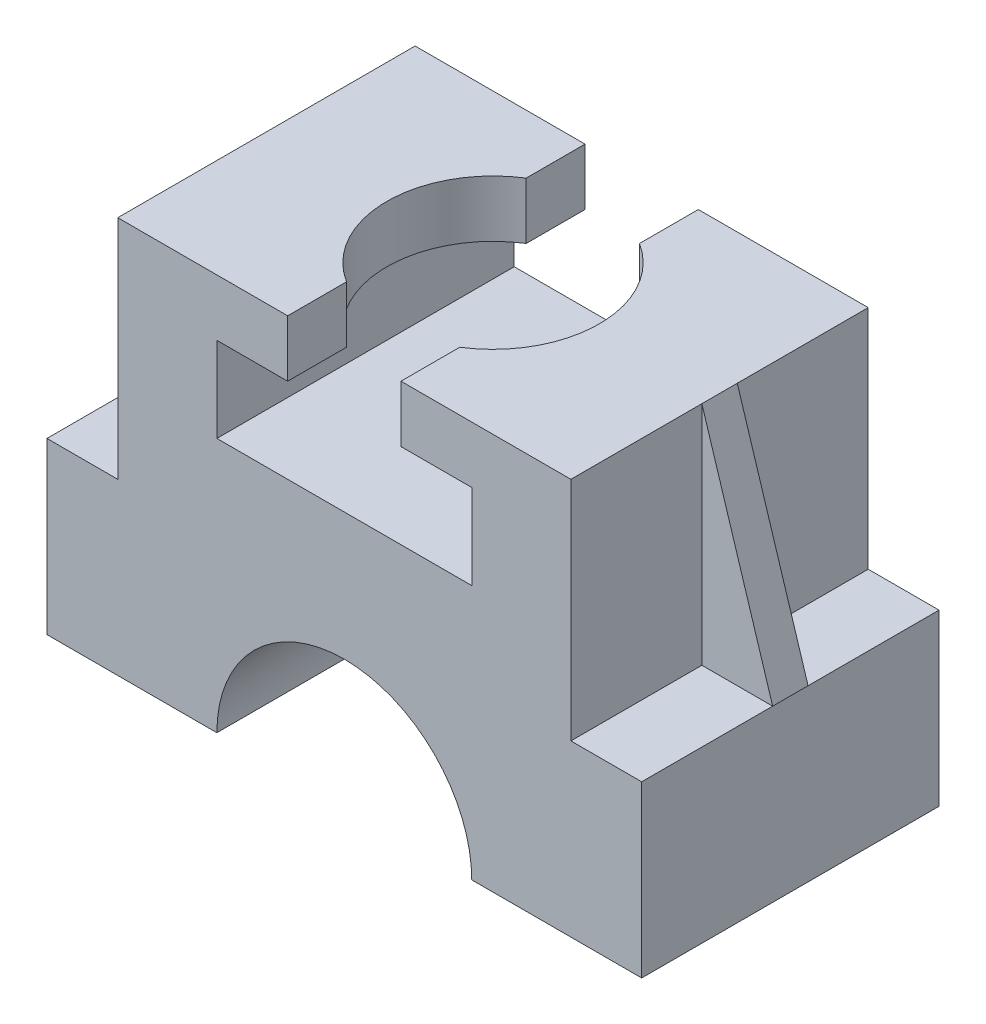
ISO-10303-21;
HEADER;
FILE_DESCRIPTION(('STEP AP214'),'2;1');
FILE_NAME('part.step','',(''),(''),'','','');
FILE_SCHEMA(('AUTOMOTIVE_DESIGN { 1 0 10303 214 1 1 1 1 }'));
ENDSEC;
DATA;
#1=APPLICATION_CONTEXT('core data for automotive mechanical design processes');
#2=APPLICATION_PROTOCOL_DEFINITION('international standard','automotive_design',2000,#1);
#3=PRODUCT_CONTEXT('',#1,'mechanical');
#4=PRODUCT('Part','Part','',(#3));
#5=PRODUCT_RELATED_PRODUCT_CATEGORY('part','',(#4));
#6=PRODUCT_DEFINITION_FORMATION('','',#4);
#7=PRODUCT_DEFINITION_CONTEXT('part definition',#1,'design');
#8=PRODUCT_DEFINITION('design','',#6,#7);
#9=PRODUCT_DEFINITION_SHAPE('','',#8);
#10=(LENGTH_UNIT() NAMED_UNIT(*) SI_UNIT(.MILLI.,.METRE.));
#11=(NAMED_UNIT(*) PLANE_ANGLE_UNIT() SI_UNIT($,.RADIAN.));
#12=(NAMED_UNIT(*) SI_UNIT($,.STERADIAN.) SOLID_ANGLE_UNIT());
#13=UNCERTAINTY_MEASURE_WITH_UNIT(LENGTH_MEASURE(1.E-05),#10,'distance_accuracy_value','');
#14=(GEOMETRIC_REPRESENTATION_CONTEXT(3) GLOBAL_UNCERTAINTY_ASSIGNED_CONTEXT((#13)) GLOBAL_UNIT_ASSIGNED_CONTEXT((#10,
#11,#12)) REPRESENTATION_CONTEXT('',''));
#15=CARTESIAN_POINT('',(0.,0.,0.));
#16=DIRECTION('',(0.,0.,1.));
#17=DIRECTION('',(1.,0.,0.));
#18=AXIS2_PLACEMENT_3D('',#15,#16,#17);
#19=CARTESIAN_POINT('',(-80.,60.,-52.5));
#20=DIRECTION('',(0.,1.,0.));
#21=DIRECTION('',(0.,0.,1.));
#22=AXIS2_PLACEMENT_3D('',#19,#20,#21);
#23=PLANE('',#22);
#24=DIRECTION('',(0.,0.,1.));
#25=VECTOR('',#24,1.);
#26=CARTESIAN_POINT('',(-105.,60.,-52.5));
#27=LINE('',#26,#25);
#28=CARTESIAN_POINT('',(-105.,60.,-52.5));
#29=VERTEX_POINT('',#28);
#30=CARTESIAN_POINT('',(-105.,60.,-6.25));
#31=VERTEX_POINT('',#30);
#32=EDGE_CURVE('E11',#29,#31,#27,.T.);
#33=ORIENTED_EDGE('',*,*,#32,.T.);
#34=DIRECTION('',(-1.,0.,0.));
#35=VECTOR('',#34,1.);
#36=CARTESIAN_POINT('',(-105.,60.,-6.25));
#37=LINE('',#36,#35);
#38=CARTESIAN_POINT('',(-80.,60.,-6.25));
#39=VERTEX_POINT('',#38);
#40=EDGE_CURVE('E243',#39,#31,#37,.T.);
#41=ORIENTED_EDGE('',*,*,#40,.F.);
#42=DIRECTION('',(0.,0.,1.));
#43=VECTOR('',#42,1.);
#44=CARTESIAN_POINT('',(-80.,60.,-52.5));
#45=LINE('',#44,#43);
#46=CARTESIAN_POINT('',(-80.,60.,-52.5));
#47=VERTEX_POINT('',#46);
#48=EDGE_CURVE('E498',#47,#39,#45,.T.);
#49=ORIENTED_EDGE('',*,*,#48,.F.);
#50=DIRECTION('',(-1.,0.,0.));
#51=VECTOR('',#50,1.);
#52=CARTESIAN_POINT('',(-80.,60.,-52.5));
#53=LINE('',#52,#51);
#54=EDGE_CURVE('E494',#47,#29,#53,.T.);
#55=ORIENTED_EDGE('',*,*,#54,.T.);
#56=EDGE_LOOP('',(#33,#41,#49,#55));
#57=FACE_BOUND('',#56,.T.);
#58=ADVANCED_FACE('F45',(#57),#23,.T.);
#59=CARTESIAN_POINT('',(-80.,140.,-52.5));
#60=DIRECTION('',(-1.,0.,0.));
#61=DIRECTION('',(0.,0.,1.));
#62=AXIS2_PLACEMENT_3D('',#59,#60,#61);
#63=PLANE('',#62);
#64=ORIENTED_EDGE('',*,*,#48,.T.);
#65=DIRECTION('',(0.,-1.,0.));
#66=VECTOR('',#65,1.);
#67=CARTESIAN_POINT('',(-80.,60.,-6.25));
#68=LINE('',#67,#66);
#69=CARTESIAN_POINT('',(-80.,140.,-6.25));
#70=VERTEX_POINT('',#69);
#71=EDGE_CURVE('E604',#70,#39,#68,.T.);
#72=ORIENTED_EDGE('',*,*,#71,.F.);
#73=DIRECTION('',(0.,0.,1.));
#74=VECTOR('',#73,1.);
#75=CARTESIAN_POINT('',(-80.,140.,-52.5));
#76=LINE('',#75,#74);
#77=CARTESIAN_POINT('',(-80.,140.,-52.5));
#78=VERTEX_POINT('',#77);
#79=EDGE_CURVE('E263',#78,#70,#76,.T.);
#80=ORIENTED_EDGE('',*,*,#79,.F.);
#81=DIRECTION('',(0.,-1.,0.));
#82=VECTOR('',#81,1.);
#83=CARTESIAN_POINT('',(-80.,140.,-52.5));
#84=LINE('',#83,#82);
#85=EDGE_CURVE('E490',#78,#47,#84,.T.);
#86=ORIENTED_EDGE('',*,*,#85,.T.);
#87=EDGE_LOOP('',(#64,#72,#80,#86));
#88=FACE_BOUND('',#87,.T.);
#89=ADVANCED_FACE('F602',(#88),#63,.T.);
#90=CARTESIAN_POINT('',(80.,60.,-52.5));
#91=DIRECTION('',(1.,0.,0.));
#92=DIRECTION('',(0.,0.,-1.));
#93=AXIS2_PLACEMENT_3D('',#90,#91,#92);
#94=PLANE('',#93);
#95=DIRECTION('',(0.,0.,1.));
#96=VECTOR('',#95,1.);
#97=CARTESIAN_POINT('',(80.,140.,-52.5));
#98=LINE('',#97,#96);
#99=CARTESIAN_POINT('',(80.,140.,-52.5));
#100=VERTEX_POINT('',#99);
#101=CARTESIAN_POINT('',(80.,140.,-6.25));
#102=VERTEX_POINT('',#101);
#103=EDGE_CURVE('E264',#100,#102,#98,.T.);
#104=ORIENTED_EDGE('',*,*,#103,.T.);
#105=DIRECTION('',(0.,-1.,0.));
#106=VECTOR('',#105,1.);
#107=CARTESIAN_POINT('',(80.,60.,-6.25));
#108=LINE('',#107,#106);
#109=CARTESIAN_POINT('',(80.,60.,-6.25));
#110=VERTEX_POINT('',#109);
#111=EDGE_CURVE('E271',#102,#110,#108,.T.);
#112=ORIENTED_EDGE('',*,*,#111,.T.);
#113=DIRECTION('',(0.,0.,1.));
#114=VECTOR('',#113,1.);
#115=CARTESIAN_POINT('',(80.,60.,-52.5));
#116=LINE('',#115,#114);
#117=CARTESIAN_POINT('',(80.,60.,-52.5));
#118=VERTEX_POINT('',#117);
#119=EDGE_CURVE('E508',#118,#110,#116,.T.);
#120=ORIENTED_EDGE('',*,*,#119,.F.);
#121=DIRECTION('',(0.,1.,0.));
#122=VECTOR('',#121,1.);
#123=CARTESIAN_POINT('',(80.,60.,-52.5));
#124=LINE('',#123,#122);
#125=EDGE_CURVE('E481',#118,#100,#124,.T.);
#126=ORIENTED_EDGE('',*,*,#125,.T.);
#127=EDGE_LOOP('',(#104,#112,#120,#126));
#128=FACE_BOUND('',#127,.T.);
#129=ADVANCED_FACE('F629',(#128),#94,.T.);
#130=CARTESIAN_POINT('',(105.,60.,-52.5));
#131=DIRECTION('',(0.,1.,0.));
#132=DIRECTION('',(-1.,0.,0.));
#133=AXIS2_PLACEMENT_3D('',#130,#131,#132);
#134=PLANE('',#133);
#135=ORIENTED_EDGE('',*,*,#119,.T.);
#136=DIRECTION('',(1.,0.,0.));
#137=VECTOR('',#136,1.);
#138=CARTESIAN_POINT('',(105.,60.,-6.25));
#139=LINE('',#138,#137);
#140=CARTESIAN_POINT('',(105.,60.,-6.25));
#141=VERTEX_POINT('',#140);
#142=EDGE_CURVE('E276',#110,#141,#139,.T.);
#143=ORIENTED_EDGE('',*,*,#142,.T.);
#144=DIRECTION('',(0.,0.,1.));
#145=VECTOR('',#144,1.);
#146=CARTESIAN_POINT('',(105.,60.,-52.5));
#147=LINE('',#146,#145);
#148=CARTESIAN_POINT('',(105.,60.,-52.5));
#149=VERTEX_POINT('',#148);
#150=EDGE_CURVE('E513',#149,#141,#147,.T.);
#151=ORIENTED_EDGE('',*,*,#150,.F.);
#152=DIRECTION('',(-1.,0.,0.));
#153=VECTOR('',#152,1.);
#154=CARTESIAN_POINT('',(105.,60.,-52.5));
#155=LINE('',#154,#153);
#156=EDGE_CURVE('E477',#149,#118,#155,.T.);
#157=ORIENTED_EDGE('',*,*,#156,.T.);
#158=EDGE_LOOP('',(#135,#143,#151,#157));
#159=FACE_BOUND('',#158,.T.);
#160=ADVANCED_FACE('F661',(#159),#134,.T.);
#161=CARTESIAN_POINT('',(80.,140.,-52.5));
#162=DIRECTION('',(0.,1.,0.));
#163=DIRECTION('',(0.,0.,1.));
#164=AXIS2_PLACEMENT_3D('',#161,#162,#163);
#165=PLANE('',#164);
#166=DIRECTION('',(0.,0.,1.));
#167=VECTOR('',#166,1.);
#168=CARTESIAN_POINT('',(-20.,140.,31.7214438511238));
#169=LINE('',#168,#167);
#170=CARTESIAN_POINT('',(-20.,140.,31.7214438511238));
#171=VERTEX_POINT('',#170);
#172=CARTESIAN_POINT('',(-20.,140.,52.5));
#173=VERTEX_POINT('',#172);
#174=EDGE_CURVE('E334',#171,#173,#169,.T.);
#175=ORIENTED_EDGE('',*,*,#174,.F.);
#176=CARTESIAN_POINT('',(0.,140.,0.));
#177=DIRECTION('',(0.,1.,0.));
#178=DIRECTION('',(0.,0.,1.));
#179=AXIS2_PLACEMENT_3D('',#176,#177,#178);
#180=CIRCLE('',#179,37.5);
#181=CARTESIAN_POINT('',(-20.,140.,-31.7214438511238));
#182=VERTEX_POINT('',#181);
#183=EDGE_CURVE('E330',#182,#171,#180,.T.);
#184=ORIENTED_EDGE('',*,*,#183,.F.);
#185=DIRECTION('',(0.,0.,1.));
#186=VECTOR('',#185,1.);
#187=CARTESIAN_POINT('',(-20.,140.,-52.5));
#188=LINE('',#187,#186);
#189=CARTESIAN_POINT('',(-20.,140.,-52.5));
#190=VERTEX_POINT('',#189);
#191=EDGE_CURVE('E326',#190,#182,#188,.T.);
#192=ORIENTED_EDGE('',*,*,#191,.F.);
#193=DIRECTION('',(-1.,0.,0.));
#194=VECTOR('',#193,1.);
#195=CARTESIAN_POINT('',(80.,140.,-52.5));
#196=LINE('',#195,#194);
#197=EDGE_CURVE('E485',#190,#78,#196,.T.);
#198=ORIENTED_EDGE('',*,*,#197,.T.);
#199=ORIENTED_EDGE('',*,*,#79,.T.);
#200=DIRECTION('',(0.,0.,-1.));
#201=VECTOR('',#200,1.);
#202=CARTESIAN_POINT('',(-80.,140.,6.25));
#203=LINE('',#202,#201);
#204=CARTESIAN_POINT('',(-80.,140.,6.25));
#205=VERTEX_POINT('',#204);
#206=EDGE_CURVE('E248',#205,#70,#203,.T.);
#207=ORIENTED_EDGE('',*,*,#206,.F.);
#208=CARTESIAN_POINT('',(-80.,140.,52.5));
#209=VERTEX_POINT('',#208);
#210=EDGE_CURVE('E255',#205,#209,#76,.T.);
#211=ORIENTED_EDGE('',*,*,#210,.T.);
#212=DIRECTION('',(-1.,0.,0.));
#213=VECTOR('',#212,1.);
#214=CARTESIAN_POINT('',(80.,140.,52.5));
#215=LINE('',#214,#213);
#216=EDGE_CURVE('E453',#173,#209,#215,.T.);
#217=ORIENTED_EDGE('',*,*,#216,.F.);
#218=EDGE_LOOP('',(#175,#184,#192,#198,#199,#207,#211,#217));
#219=FACE_BOUND('',#218,.T.);
#220=ADVANCED_FACE('F268',(#219),#165,.T.);
#221=CARTESIAN_POINT('',(-45.,120.,-52.5));
#222=DIRECTION('',(0.,1.,0.));
#223=DIRECTION('',(0.,0.,1.));
#224=AXIS2_PLACEMENT_3D('',#221,#222,#223);
#225=PLANE('',#224);
#226=CARTESIAN_POINT('',(0.,120.,0.));
#227=DIRECTION('',(0.,1.,0.));
#228=DIRECTION('',(0.,0.,1.));
#229=AXIS2_PLACEMENT_3D('',#226,#227,#228);
#230=CIRCLE('',#229,37.5);
#231=CARTESIAN_POINT('',(-20.,120.,31.7214438511238));
#232=VERTEX_POINT('',#231);
#233=CARTESIAN_POINT('',(-20.,120.,-31.7214438511238));
#234=VERTEX_POINT('',#233);
#235=EDGE_CURVE('E312',#232,#234,#230,.F.);
#236=ORIENTED_EDGE('',*,*,#235,.F.);
#237=DIRECTION('',(0.,0.,-1.));
#238=VECTOR('',#237,1.);
#239=CARTESIAN_POINT('',(-20.,120.,31.7214438511238));
#240=LINE('',#239,#238);
#241=CARTESIAN_POINT('',(-20.,120.,52.5));
#242=VERTEX_POINT('',#241);
#243=EDGE_CURVE('E315',#242,#232,#240,.T.);
#244=ORIENTED_EDGE('',*,*,#243,.F.);
#245=DIRECTION('',(-1.,0.,0.));
#246=VECTOR('',#245,1.);
#247=CARTESIAN_POINT('',(-45.,120.,52.5));
#248=LINE('',#247,#246);
#249=CARTESIAN_POINT('',(-45.,120.,52.5));
#250=VERTEX_POINT('',#249);
#251=EDGE_CURVE('E371',#242,#250,#248,.T.);
#252=ORIENTED_EDGE('',*,*,#251,.T.);
#253=DIRECTION('',(0.,0.,1.));
#254=VECTOR('',#253,1.);
#255=CARTESIAN_POINT('',(-45.,120.,-52.5));
#256=LINE('',#255,#254);
#257=CARTESIAN_POINT('',(-45.,120.,-52.5));
#258=VERTEX_POINT('',#257);
#259=EDGE_CURVE('E389',#258,#250,#256,.T.);
#260=ORIENTED_EDGE('',*,*,#259,.F.);
#261=DIRECTION('',(-1.,0.,0.));
#262=VECTOR('',#261,1.);
#263=CARTESIAN_POINT('',(-45.,120.,-52.5));
#264=LINE('',#263,#262);
#265=CARTESIAN_POINT('',(-20.,120.,-52.5));
#266=VERTEX_POINT('',#265);
#267=EDGE_CURVE('E377',#266,#258,#264,.T.);
#268=ORIENTED_EDGE('',*,*,#267,.F.);
#269=DIRECTION('',(0.,0.,-1.));
#270=VECTOR('',#269,1.);
#271=CARTESIAN_POINT('',(-20.,120.,-52.5));
#272=LINE('',#271,#270);
#273=EDGE_CURVE('E309',#234,#266,#272,.T.);
#274=ORIENTED_EDGE('',*,*,#273,.F.);
#275=EDGE_LOOP('',(#236,#244,#252,#260,#268,#274));
#276=FACE_BOUND('',#275,.T.);
#277=ADVANCED_FACE('F586',(#276),#225,.F.);
#278=CARTESIAN_POINT('',(-105.,0.,-52.5));
#279=DIRECTION('',(0.,-1.,0.));
#280=DIRECTION('',(0.,0.,-1.));
#281=AXIS2_PLACEMENT_3D('',#278,#279,#280);
#282=PLANE('',#281);
#283=DIRECTION('',(0.,0.,1.));
#284=VECTOR('',#283,1.);
#285=CARTESIAN_POINT('',(45.,0.,-52.5));
#286=LINE('',#285,#284);
#287=CARTESIAN_POINT('',(45.,0.,-52.5));
#288=VERTEX_POINT('',#287);
#289=CARTESIAN_POINT('',(45.,0.,52.5));
#290=VERTEX_POINT('',#289);
#291=EDGE_CURVE('E426',#288,#290,#286,.T.);
#292=ORIENTED_EDGE('',*,*,#291,.F.);
#293=DIRECTION('',(1.,0.,0.));
#294=VECTOR('',#293,1.);
#295=CARTESIAN_POINT('',(-105.,0.,-52.5));
#296=LINE('',#295,#294);
#297=CARTESIAN_POINT('',(105.,0.,-52.5));
#298=VERTEX_POINT('',#297);
#299=EDGE_CURVE('E468',#288,#298,#296,.T.);
#300=ORIENTED_EDGE('',*,*,#299,.T.);
#301=DIRECTION('',(0.,0.,1.));
#302=VECTOR('',#301,1.);
#303=CARTESIAN_POINT('',(105.,0.,-52.5));
#304=LINE('',#303,#302);
#305=CARTESIAN_POINT('',(105.,0.,52.5));
#306=VERTEX_POINT('',#305);
#307=EDGE_CURVE('E517',#298,#306,#304,.T.);
#308=ORIENTED_EDGE('',*,*,#307,.T.);
#309=DIRECTION('',(1.,0.,0.));
#310=VECTOR('',#309,1.);
#311=CARTESIAN_POINT('',(-105.,0.,52.5));
#312=LINE('',#311,#310);
#313=EDGE_CURVE('E436',#290,#306,#312,.T.);
#314=ORIENTED_EDGE('',*,*,#313,.F.);
#315=EDGE_LOOP('',(#292,#300,#308,#314));
#316=FACE_BOUND('',#315,.T.);
#317=ADVANCED_FACE('F637',(#316),#282,.T.);
#318=CARTESIAN_POINT('',(-105.,60.,-52.5));
#319=DIRECTION('',(-1.,0.,0.));
#320=DIRECTION('',(0.,-1.,0.));
#321=AXIS2_PLACEMENT_3D('',#318,#319,#320);
#322=PLANE('',#321);
#323=DIRECTION('',(0.,0.,1.));
#324=VECTOR('',#323,1.);
#325=CARTESIAN_POINT('',(-105.,0.,-52.5));
#326=LINE('',#325,#324);
#327=CARTESIAN_POINT('',(-105.,0.,-52.5));
#328=VERTEX_POINT('',#327);
#329=CARTESIAN_POINT('',(-105.,0.,52.5));
#330=VERTEX_POINT('',#329);
#331=EDGE_CURVE('E49',#328,#330,#326,.T.);
#332=ORIENTED_EDGE('',*,*,#331,.T.);
#333=DIRECTION('',(0.,-1.,0.));
#334=VECTOR('',#333,1.);
#335=CARTESIAN_POINT('',(-105.,60.,52.5));
#336=LINE('',#335,#334);
#337=CARTESIAN_POINT('',(-105.,60.,52.5));
#338=VERTEX_POINT('',#337);
#339=EDGE_CURVE('E429',#338,#330,#336,.T.);
#340=ORIENTED_EDGE('',*,*,#339,.F.);
#341=CARTESIAN_POINT('',(-105.,60.,6.25));
#342=VERTEX_POINT('',#341);
#343=EDGE_CURVE('E55',#342,#338,#27,.T.);
#344=ORIENTED_EDGE('',*,*,#343,.F.);
#345=DIRECTION('',(0.,0.,-1.));
#346=VECTOR('',#345,1.);
#347=CARTESIAN_POINT('',(-105.,60.,6.25));
#348=LINE('',#347,#346);
#349=EDGE_CURVE('E251',#342,#31,#348,.T.);
#350=ORIENTED_EDGE('',*,*,#349,.T.);
#351=ORIENTED_EDGE('',*,*,#32,.F.);
#352=DIRECTION('',(0.,-1.,0.));
#353=VECTOR('',#352,1.);
#354=CARTESIAN_POINT('',(-105.,60.,-52.5));
#355=LINE('',#354,#353);
#356=EDGE_CURVE('E464',#29,#328,#355,.T.);
#357=ORIENTED_EDGE('',*,*,#356,.T.);
#358=EDGE_LOOP('',(#332,#340,#344,#350,#351,#357));
#359=FACE_BOUND('',#358,.T.);
#360=ADVANCED_FACE('F47',(#359),#322,.T.);
#361=DIRECTION('',(-1.,0.,0.));
#362=VECTOR('',#361,1.);
#363=CARTESIAN_POINT('',(-105.,60.,6.25));
#364=LINE('',#363,#362);
#365=CARTESIAN_POINT('',(-80.,60.,6.25));
#366=VERTEX_POINT('',#365);
#367=EDGE_CURVE('E238',#366,#342,#364,.T.);
#368=ORIENTED_EDGE('',*,*,#367,.T.);
#369=ORIENTED_EDGE('',*,*,#343,.T.);
#370=DIRECTION('',(-1.,0.,0.));
#371=VECTOR('',#370,1.);
#372=CARTESIAN_POINT('',(-80.,60.,52.5));
#373=LINE('',#372,#371);
#374=CARTESIAN_POINT('',(-80.,60.,52.5));
#375=VERTEX_POINT('',#374);
#376=EDGE_CURVE('E460',#375,#338,#373,.T.);
#377=ORIENTED_EDGE('',*,*,#376,.F.);
#378=EDGE_CURVE('E501',#366,#375,#45,.T.);
#379=ORIENTED_EDGE('',*,*,#378,.F.);
#380=EDGE_LOOP('',(#368,#369,#377,#379));
#381=FACE_BOUND('',#380,.T.);
#382=ADVANCED_FACE('F540',(#381),#23,.T.);
#383=DIRECTION('',(0.,-1.,0.));
#384=VECTOR('',#383,1.);
#385=CARTESIAN_POINT('',(-80.,60.,6.25));
#386=LINE('',#385,#384);
#387=EDGE_CURVE('E233',#205,#366,#386,.T.);
#388=ORIENTED_EDGE('',*,*,#387,.T.);
#389=ORIENTED_EDGE('',*,*,#378,.T.);
#390=DIRECTION('',(0.,-1.,0.));
#391=VECTOR('',#390,1.);
#392=CARTESIAN_POINT('',(-80.,140.,52.5));
#393=LINE('',#392,#391);
#394=EDGE_CURVE('E258',#209,#375,#393,.T.);
#395=ORIENTED_EDGE('',*,*,#394,.F.);
#396=ORIENTED_EDGE('',*,*,#210,.F.);
#397=EDGE_LOOP('',(#388,#389,#395,#396));
#398=FACE_BOUND('',#397,.T.);
#399=ADVANCED_FACE('F256',(#398),#63,.T.);
#400=DIRECTION('',(0.,0.,-1.));
#401=VECTOR('',#400,1.);
#402=CARTESIAN_POINT('',(20.,140.,31.7214438511238));
#403=LINE('',#402,#401);
#404=CARTESIAN_POINT('',(20.,140.,52.5));
#405=VERTEX_POINT('',#404);
#406=CARTESIAN_POINT('',(20.,140.,31.7214438511238));
#407=VERTEX_POINT('',#406);
#408=EDGE_CURVE('E337',#405,#407,#403,.T.);
#409=ORIENTED_EDGE('',*,*,#408,.F.);
#410=CARTESIAN_POINT('',(80.,140.,52.5));
#411=VERTEX_POINT('',#410);
#412=EDGE_CURVE('E454',#411,#405,#215,.T.);
#413=ORIENTED_EDGE('',*,*,#412,.F.);
#414=CARTESIAN_POINT('',(80.,140.,6.25));
#415=VERTEX_POINT('',#414);
#416=EDGE_CURVE('E507',#415,#411,#98,.T.);
#417=ORIENTED_EDGE('',*,*,#416,.F.);
#418=DIRECTION('',(0.,0.,-1.));
#419=VECTOR('',#418,1.);
#420=CARTESIAN_POINT('',(80.,140.,6.25));
#421=LINE('',#420,#419);
#422=EDGE_CURVE('E289',#415,#102,#421,.T.);
#423=ORIENTED_EDGE('',*,*,#422,.T.);
#424=ORIENTED_EDGE('',*,*,#103,.F.);
#425=CARTESIAN_POINT('',(20.,140.,-52.5));
#426=VERTEX_POINT('',#425);
#427=EDGE_CURVE('E486',#100,#426,#196,.T.);
#428=ORIENTED_EDGE('',*,*,#427,.T.);
#429=DIRECTION('',(0.,0.,-1.));
#430=VECTOR('',#429,1.);
#431=CARTESIAN_POINT('',(20.,140.,-52.5));
#432=LINE('',#431,#430);
#433=CARTESIAN_POINT('',(20.,140.,-31.7214438511238));
#434=VERTEX_POINT('',#433);
#435=EDGE_CURVE('E323',#434,#426,#432,.T.);
#436=ORIENTED_EDGE('',*,*,#435,.F.);
#437=CARTESIAN_POINT('',(0.,140.,0.));
#438=DIRECTION('',(0.,1.,0.));
#439=DIRECTION('',(0.,0.,1.));
#440=AXIS2_PLACEMENT_3D('',#437,#438,#439);
#441=CIRCLE('',#440,37.5);
#442=EDGE_CURVE('E319',#407,#434,#441,.T.);
#443=ORIENTED_EDGE('',*,*,#442,.F.);
#444=EDGE_LOOP('',(#409,#413,#417,#423,#424,#428,#436,#443));
#445=FACE_BOUND('',#444,.T.);
#446=ADVANCED_FACE('F559',(#445),#165,.T.);
#447=DIRECTION('',(0.,-1.,0.));
#448=VECTOR('',#447,1.);
#449=CARTESIAN_POINT('',(80.,60.,6.25));
#450=LINE('',#449,#448);
#451=CARTESIAN_POINT('',(80.,60.,6.25));
#452=VERTEX_POINT('',#451);
#453=EDGE_CURVE('E281',#415,#452,#450,.T.);
#454=ORIENTED_EDGE('',*,*,#453,.F.);
#455=ORIENTED_EDGE('',*,*,#416,.T.);
#456=DIRECTION('',(0.,1.,0.));
#457=VECTOR('',#456,1.);
#458=CARTESIAN_POINT('',(80.,60.,52.5));
#459=LINE('',#458,#457);
#460=CARTESIAN_POINT('',(80.,60.,52.5));
#461=VERTEX_POINT('',#460);
#462=EDGE_CURVE('E449',#461,#411,#459,.T.);
#463=ORIENTED_EDGE('',*,*,#462,.F.);
#464=EDGE_CURVE('E512',#452,#461,#116,.T.);
#465=ORIENTED_EDGE('',*,*,#464,.F.);
#466=EDGE_LOOP('',(#454,#455,#463,#465));
#467=FACE_BOUND('',#466,.T.);
#468=ADVANCED_FACE('F555',(#467),#94,.T.);
#469=DIRECTION('',(1.,0.,0.));
#470=VECTOR('',#469,1.);
#471=CARTESIAN_POINT('',(105.,60.,6.25));
#472=LINE('',#471,#470);
#473=CARTESIAN_POINT('',(105.,60.,6.25));
#474=VERTEX_POINT('',#473);
#475=EDGE_CURVE('E284',#452,#474,#472,.T.);
#476=ORIENTED_EDGE('',*,*,#475,.F.);
#477=ORIENTED_EDGE('',*,*,#464,.T.);
#478=DIRECTION('',(-1.,0.,0.));
#479=VECTOR('',#478,1.);
#480=CARTESIAN_POINT('',(105.,60.,52.5));
#481=LINE('',#480,#479);
#482=CARTESIAN_POINT('',(105.,60.,52.5));
#483=VERTEX_POINT('',#482);
#484=EDGE_CURVE('E445',#483,#461,#481,.T.);
#485=ORIENTED_EDGE('',*,*,#484,.F.);
#486=EDGE_CURVE('E516',#474,#483,#147,.T.);
#487=ORIENTED_EDGE('',*,*,#486,.F.);
#488=EDGE_LOOP('',(#476,#477,#485,#487));
#489=FACE_BOUND('',#488,.T.);
#490=ADVANCED_FACE('F549',(#489),#134,.T.);
#491=CARTESIAN_POINT('',(105.,0.,-52.5));
#492=DIRECTION('',(1.,0.,0.));
#493=DIRECTION('',(0.,1.,0.));
#494=AXIS2_PLACEMENT_3D('',#491,#492,#493);
#495=PLANE('',#494);
#496=ORIENTED_EDGE('',*,*,#150,.T.);
#497=DIRECTION('',(0.,0.,-1.));
#498=VECTOR('',#497,1.);
#499=CARTESIAN_POINT('',(105.,60.,6.25));
#500=LINE('',#499,#498);
#501=EDGE_CURVE('E299',#474,#141,#500,.T.);
#502=ORIENTED_EDGE('',*,*,#501,.F.);
#503=ORIENTED_EDGE('',*,*,#486,.T.);
#504=DIRECTION('',(0.,1.,0.));
#505=VECTOR('',#504,1.);
#506=CARTESIAN_POINT('',(105.,0.,52.5));
#507=LINE('',#506,#505);
#508=EDGE_CURVE('E441',#306,#483,#507,.T.);
#509=ORIENTED_EDGE('',*,*,#508,.F.);
#510=ORIENTED_EDGE('',*,*,#307,.F.);
#511=DIRECTION('',(0.,1.,0.));
#512=VECTOR('',#511,1.);
#513=CARTESIAN_POINT('',(105.,0.,-52.5));
#514=LINE('',#513,#512);
#515=EDGE_CURVE('E473',#298,#149,#514,.T.);
#516=ORIENTED_EDGE('',*,*,#515,.T.);
#517=EDGE_LOOP('',(#496,#502,#503,#509,#510,#516));
#518=FACE_BOUND('',#517,.T.);
#519=ADVANCED_FACE('F649',(#518),#495,.T.);
#520=DIRECTION('',(0.,0.,1.));
#521=VECTOR('',#520,1.);
#522=CARTESIAN_POINT('',(-45.,0.,-52.5));
#523=LINE('',#522,#521);
#524=CARTESIAN_POINT('',(-45.,0.,-52.5));
#525=VERTEX_POINT('',#524);
#526=CARTESIAN_POINT('',(-45.,0.,52.5));
#527=VERTEX_POINT('',#526);
#528=EDGE_CURVE('E423',#525,#527,#523,.T.);
#529=ORIENTED_EDGE('',*,*,#528,.T.);
#530=EDGE_CURVE('E437',#330,#527,#312,.T.);
#531=ORIENTED_EDGE('',*,*,#530,.F.);
#532=ORIENTED_EDGE('',*,*,#331,.F.);
#533=EDGE_CURVE('E469',#328,#525,#296,.T.);
#534=ORIENTED_EDGE('',*,*,#533,.T.);
#535=EDGE_LOOP('',(#529,#531,#532,#534));
#536=FACE_BOUND('',#535,.T.);
#537=ADVANCED_FACE('F533',(#536),#282,.T.);
#538=CARTESIAN_POINT('',(0.,0.,-52.5));
#539=DIRECTION('',(0.,0.,1.));
#540=DIRECTION('',(1.,0.,0.));
#541=AXIS2_PLACEMENT_3D('',#538,#539,#540);
#542=PLANE('',#541);
#543=ORIENTED_EDGE('',*,*,#197,.F.);
#544=DIRECTION('',(0.,1.,0.));
#545=VECTOR('',#544,1.);
#546=CARTESIAN_POINT('',(-20.,-0.001000000000001,-52.5));
#547=LINE('',#546,#545);
#548=EDGE_CURVE('E359',#266,#190,#547,.T.);
#549=ORIENTED_EDGE('',*,*,#548,.F.);
#550=ORIENTED_EDGE('',*,*,#267,.T.);
#551=DIRECTION('',(0.,-1.,0.));
#552=VECTOR('',#551,1.);
#553=CARTESIAN_POINT('',(-45.,120.,-52.5));
#554=LINE('',#553,#552);
#555=CARTESIAN_POINT('',(-45.,90.,-52.5));
#556=VERTEX_POINT('',#555);
#557=EDGE_CURVE('E376',#258,#556,#554,.T.);
#558=ORIENTED_EDGE('',*,*,#557,.T.);
#559=DIRECTION('',(1.,0.,0.));
#560=VECTOR('',#559,1.);
#561=CARTESIAN_POINT('',(-45.,90.,-52.5));
#562=LINE('',#561,#560);
#563=CARTESIAN_POINT('',(45.,90.,-52.5));
#564=VERTEX_POINT('',#563);
#565=EDGE_CURVE('E381',#556,#564,#562,.T.);
#566=ORIENTED_EDGE('',*,*,#565,.T.);
#567=DIRECTION('',(0.,1.,0.));
#568=VECTOR('',#567,1.);
#569=CARTESIAN_POINT('',(45.,90.,-52.5));
#570=LINE('',#569,#568);
#571=CARTESIAN_POINT('',(45.,120.,-52.5));
#572=VERTEX_POINT('',#571);
#573=EDGE_CURVE('E385',#564,#572,#570,.T.);
#574=ORIENTED_EDGE('',*,*,#573,.T.);
#575=CARTESIAN_POINT('',(20.,120.,-52.5));
#576=VERTEX_POINT('',#575);
#577=EDGE_CURVE('E372',#572,#576,#264,.T.);
#578=ORIENTED_EDGE('',*,*,#577,.T.);
#579=DIRECTION('',(0.,1.,0.));
#580=VECTOR('',#579,1.);
#581=CARTESIAN_POINT('',(20.,-0.001000000000001,-52.5));
#582=LINE('',#581,#580);
#583=EDGE_CURVE('E362',#576,#426,#582,.T.);
#584=ORIENTED_EDGE('',*,*,#583,.T.);
#585=ORIENTED_EDGE('',*,*,#427,.F.);
#586=ORIENTED_EDGE('',*,*,#125,.F.);
#587=ORIENTED_EDGE('',*,*,#156,.F.);
#588=ORIENTED_EDGE('',*,*,#515,.F.);
#589=ORIENTED_EDGE('',*,*,#299,.F.);
#590=CARTESIAN_POINT('',(0.,0.,-52.5));
#591=DIRECTION('',(0.,0.,1.));
#592=DIRECTION('',(-1.,0.,0.));
#593=AXIS2_PLACEMENT_3D('',#590,#591,#592);
#594=CIRCLE('',#593,45.);
#595=EDGE_CURVE('E419',#288,#525,#594,.T.);
#596=ORIENTED_EDGE('',*,*,#595,.T.);
#597=ORIENTED_EDGE('',*,*,#533,.F.);
#598=ORIENTED_EDGE('',*,*,#356,.F.);
#599=ORIENTED_EDGE('',*,*,#54,.F.);
#600=ORIENTED_EDGE('',*,*,#85,.F.);
#601=EDGE_LOOP('',(#543,#549,#550,#558,#566,#574,#578,#584,#585,#586,#587,#588,#589,#596,#597,
#598,#599,#600));
#602=FACE_BOUND('',#601,.T.);
#603=ADVANCED_FACE('F605',(#602),#542,.F.);
#604=CARTESIAN_POINT('',(0.,0.,52.5));
#605=DIRECTION('',(0.,0.,1.));
#606=DIRECTION('',(1.,0.,0.));
#607=AXIS2_PLACEMENT_3D('',#604,#605,#606);
#608=PLANE('',#607);
#609=DIRECTION('',(0.,1.,0.));
#610=VECTOR('',#609,1.);
#611=CARTESIAN_POINT('',(20.,-0.001000000000001,52.5));
#612=LINE('',#611,#610);
#613=CARTESIAN_POINT('',(20.,120.,52.5));
#614=VERTEX_POINT('',#613);
#615=EDGE_CURVE('E346',#614,#405,#612,.T.);
#616=ORIENTED_EDGE('',*,*,#615,.F.);
#617=CARTESIAN_POINT('',(45.,120.,52.5));
#618=VERTEX_POINT('',#617);
#619=EDGE_CURVE('E390',#618,#614,#248,.T.);
#620=ORIENTED_EDGE('',*,*,#619,.F.);
#621=DIRECTION('',(0.,1.,0.));
#622=VECTOR('',#621,1.);
#623=CARTESIAN_POINT('',(45.,90.,52.5));
#624=LINE('',#623,#622);
#625=CARTESIAN_POINT('',(45.,90.,52.5));
#626=VERTEX_POINT('',#625);
#627=EDGE_CURVE('E402',#626,#618,#624,.T.);
#628=ORIENTED_EDGE('',*,*,#627,.F.);
#629=DIRECTION('',(1.,0.,0.));
#630=VECTOR('',#629,1.);
#631=CARTESIAN_POINT('',(-45.,90.,52.5));
#632=LINE('',#631,#630);
#633=CARTESIAN_POINT('',(-45.,90.,52.5));
#634=VERTEX_POINT('',#633);
#635=EDGE_CURVE('E398',#634,#626,#632,.T.);
#636=ORIENTED_EDGE('',*,*,#635,.F.);
#637=DIRECTION('',(0.,-1.,0.));
#638=VECTOR('',#637,1.);
#639=CARTESIAN_POINT('',(-45.,120.,52.5));
#640=LINE('',#639,#638);
#641=EDGE_CURVE('E394',#250,#634,#640,.T.);
#642=ORIENTED_EDGE('',*,*,#641,.F.);
#643=ORIENTED_EDGE('',*,*,#251,.F.);
#644=DIRECTION('',(0.,1.,0.));
#645=VECTOR('',#644,1.);
#646=CARTESIAN_POINT('',(-20.,-0.001000000000001,52.5));
#647=LINE('',#646,#645);
#648=EDGE_CURVE('E349',#242,#173,#647,.T.);
#649=ORIENTED_EDGE('',*,*,#648,.T.);
#650=ORIENTED_EDGE('',*,*,#216,.T.);
#651=ORIENTED_EDGE('',*,*,#394,.T.);
#652=ORIENTED_EDGE('',*,*,#376,.T.);
#653=ORIENTED_EDGE('',*,*,#339,.T.);
#654=ORIENTED_EDGE('',*,*,#530,.T.);
#655=CARTESIAN_POINT('',(0.,0.,52.5));
#656=DIRECTION('',(0.,0.,1.));
#657=DIRECTION('',(-1.,0.,0.));
#658=AXIS2_PLACEMENT_3D('',#655,#656,#657);
#659=CIRCLE('',#658,45.);
#660=EDGE_CURVE('E409',#290,#527,#659,.T.);
#661=ORIENTED_EDGE('',*,*,#660,.F.);
#662=ORIENTED_EDGE('',*,*,#313,.T.);
#663=ORIENTED_EDGE('',*,*,#508,.T.);
#664=ORIENTED_EDGE('',*,*,#484,.T.);
#665=ORIENTED_EDGE('',*,*,#462,.T.);
#666=ORIENTED_EDGE('',*,*,#412,.T.);
#667=EDGE_LOOP('',(#616,#620,#628,#636,#642,#643,#649,#650,#651,#652,#653,#654,#661,#662,#663,
#664,#665,#666));
#668=FACE_BOUND('',#667,.T.);
#669=ADVANCED_FACE('F537',(#668),#608,.T.);
#670=CARTESIAN_POINT('',(0.,0.,-52.5));
#671=DIRECTION('',(0.,0.,1.));
#672=DIRECTION('',(1.,0.,0.));
#673=AXIS2_PLACEMENT_3D('',#670,#671,#672);
#674=CYLINDRICAL_SURFACE('',#673,45.);
#675=ORIENTED_EDGE('',*,*,#660,.T.);
#676=ORIENTED_EDGE('',*,*,#528,.F.);
#677=ORIENTED_EDGE('',*,*,#595,.F.);
#678=ORIENTED_EDGE('',*,*,#291,.T.);
#679=EDGE_LOOP('',(#675,#676,#677,#678));
#680=FACE_BOUND('',#679,.T.);
#681=ADVANCED_FACE('F718',(#680),#674,.F.);
#682=ORIENTED_EDGE('',*,*,#619,.T.);
#683=DIRECTION('',(0.,0.,1.));
#684=VECTOR('',#683,1.);
#685=CARTESIAN_POINT('',(20.,120.,31.7214438511238));
#686=LINE('',#685,#684);
#687=CARTESIAN_POINT('',(20.,120.,31.7214438511238));
#688=VERTEX_POINT('',#687);
#689=EDGE_CURVE('E306',#688,#614,#686,.T.);
#690=ORIENTED_EDGE('',*,*,#689,.F.);
#691=CARTESIAN_POINT('',(0.,120.,0.));
#692=DIRECTION('',(0.,1.,0.));
#693=DIRECTION('',(0.,0.,1.));
#694=AXIS2_PLACEMENT_3D('',#691,#692,#693);
#695=CIRCLE('',#694,37.5);
#696=CARTESIAN_POINT('',(20.,120.,-31.7214438511238));
#697=VERTEX_POINT('',#696);
#698=EDGE_CURVE('E302',#697,#688,#695,.F.);
#699=ORIENTED_EDGE('',*,*,#698,.F.);
#700=DIRECTION('',(0.,0.,1.));
#701=VECTOR('',#700,1.);
#702=CARTESIAN_POINT('',(20.,120.,-52.5));
#703=LINE('',#702,#701);
#704=EDGE_CURVE('E345',#576,#697,#703,.T.);
#705=ORIENTED_EDGE('',*,*,#704,.F.);
#706=ORIENTED_EDGE('',*,*,#577,.F.);
#707=DIRECTION('',(0.,0.,1.));
#708=VECTOR('',#707,1.);
#709=CARTESIAN_POINT('',(45.,120.,-52.5));
#710=LINE('',#709,#708);
#711=EDGE_CURVE('E406',#572,#618,#710,.T.);
#712=ORIENTED_EDGE('',*,*,#711,.T.);
#713=EDGE_LOOP('',(#682,#690,#699,#705,#706,#712));
#714=FACE_BOUND('',#713,.T.);
#715=ADVANCED_FACE('F566',(#714),#225,.F.);
#716=CARTESIAN_POINT('',(45.,90.,-52.5));
#717=DIRECTION('',(1.,0.,0.));
#718=DIRECTION('',(0.,0.,-1.));
#719=AXIS2_PLACEMENT_3D('',#716,#717,#718);
#720=PLANE('',#719);
#721=ORIENTED_EDGE('',*,*,#627,.T.);
#722=ORIENTED_EDGE('',*,*,#711,.F.);
#723=ORIENTED_EDGE('',*,*,#573,.F.);
#724=DIRECTION('',(0.,0.,1.));
#725=VECTOR('',#724,1.);
#726=CARTESIAN_POINT('',(45.,90.,-52.5));
#727=LINE('',#726,#725);
#728=EDGE_CURVE('E410',#564,#626,#727,.T.);
#729=ORIENTED_EDGE('',*,*,#728,.T.);
#730=EDGE_LOOP('',(#721,#722,#723,#729));
#731=FACE_BOUND('',#730,.T.);
#732=ADVANCED_FACE('F572',(#731),#720,.F.);
#733=CARTESIAN_POINT('',(-45.,90.,-52.5));
#734=DIRECTION('',(0.,-1.,0.));
#735=DIRECTION('',(0.,0.,-1.));
#736=AXIS2_PLACEMENT_3D('',#733,#734,#735);
#737=PLANE('',#736);
#738=ORIENTED_EDGE('',*,*,#635,.T.);
#739=ORIENTED_EDGE('',*,*,#728,.F.);
#740=ORIENTED_EDGE('',*,*,#565,.F.);
#741=DIRECTION('',(0.,0.,1.));
#742=VECTOR('',#741,1.);
#743=CARTESIAN_POINT('',(-45.,90.,-52.5));
#744=LINE('',#743,#742);
#745=EDGE_CURVE('E413',#556,#634,#744,.T.);
#746=ORIENTED_EDGE('',*,*,#745,.T.);
#747=EDGE_LOOP('',(#738,#739,#740,#746));
#748=FACE_BOUND('',#747,.T.);
#749=ADVANCED_FACE('F577',(#748),#737,.F.);
#750=CARTESIAN_POINT('',(-45.,120.,-52.5));
#751=DIRECTION('',(-1.,0.,0.));
#752=DIRECTION('',(0.,0.,1.));
#753=AXIS2_PLACEMENT_3D('',#750,#751,#752);
#754=PLANE('',#753);
#755=ORIENTED_EDGE('',*,*,#641,.T.);
#756=ORIENTED_EDGE('',*,*,#745,.F.);
#757=ORIENTED_EDGE('',*,*,#557,.F.);
#758=ORIENTED_EDGE('',*,*,#259,.T.);
#759=EDGE_LOOP('',(#755,#756,#757,#758));
#760=FACE_BOUND('',#759,.T.);
#761=ADVANCED_FACE('F581',(#760),#754,.F.);
#762=CARTESIAN_POINT('',(20.,-0.001000000000001,31.7214438511238));
#763=DIRECTION('',(1.,0.,0.));
#764=DIRECTION('',(0.,0.,-1.));
#765=AXIS2_PLACEMENT_3D('',#762,#763,#764);
#766=PLANE('',#765);
#767=ORIENTED_EDGE('',*,*,#689,.T.);
#768=ORIENTED_EDGE('',*,*,#615,.T.);
#769=ORIENTED_EDGE('',*,*,#408,.T.);
#770=DIRECTION('',(0.,1.,0.));
#771=VECTOR('',#770,1.);
#772=CARTESIAN_POINT('',(20.,-0.001000000000001,31.7214438511238));
#773=LINE('',#772,#771);
#774=EDGE_CURVE('E342',#688,#407,#773,.T.);
#775=ORIENTED_EDGE('',*,*,#774,.F.);
#776=EDGE_LOOP('',(#767,#768,#769,#775));
#777=FACE_BOUND('',#776,.T.);
#778=ADVANCED_FACE('F686',(#777),#766,.F.);
#779=CARTESIAN_POINT('',(20.,-0.001000000000001,-52.5));
#780=DIRECTION('',(1.,0.,0.));
#781=DIRECTION('',(0.,0.,-1.));
#782=AXIS2_PLACEMENT_3D('',#779,#780,#781);
#783=PLANE('',#782);
#784=ORIENTED_EDGE('',*,*,#704,.T.);
#785=DIRECTION('',(0.,1.,0.));
#786=VECTOR('',#785,1.);
#787=CARTESIAN_POINT('',(20.,-0.001000000000001,-31.7214438511238));
#788=LINE('',#787,#786);
#789=EDGE_CURVE('E341',#697,#434,#788,.T.);
#790=ORIENTED_EDGE('',*,*,#789,.T.);
#791=ORIENTED_EDGE('',*,*,#435,.T.);
#792=ORIENTED_EDGE('',*,*,#583,.F.);
#793=EDGE_LOOP('',(#784,#790,#791,#792));
#794=FACE_BOUND('',#793,.T.);
#795=ADVANCED_FACE('F683',(#794),#783,.F.);
#796=CARTESIAN_POINT('',(0.,-0.001000000000001,0.));
#797=DIRECTION('',(0.,1.,0.));
#798=DIRECTION('',(0.,0.,1.));
#799=AXIS2_PLACEMENT_3D('',#796,#797,#798);
#800=CYLINDRICAL_SURFACE('',#799,37.5);
#801=ORIENTED_EDGE('',*,*,#698,.T.);
#802=ORIENTED_EDGE('',*,*,#774,.T.);
#803=ORIENTED_EDGE('',*,*,#442,.T.);
#804=ORIENTED_EDGE('',*,*,#789,.F.);
#805=EDGE_LOOP('',(#801,#802,#803,#804));
#806=FACE_BOUND('',#805,.T.);
#807=ADVANCED_FACE('F685',(#806),#800,.F.);
#808=CARTESIAN_POINT('',(-20.,-0.001000000000001,31.7214438511238));
#809=DIRECTION('',(-1.,0.,0.));
#810=DIRECTION('',(0.,0.,1.));
#811=AXIS2_PLACEMENT_3D('',#808,#809,#810);
#812=PLANE('',#811);
#813=ORIENTED_EDGE('',*,*,#243,.T.);
#814=DIRECTION('',(0.,1.,0.));
#815=VECTOR('',#814,1.);
#816=CARTESIAN_POINT('',(-20.,-0.001000000000001,31.7214438511238));
#817=LINE('',#816,#815);
#818=EDGE_CURVE('E353',#232,#171,#817,.T.);
#819=ORIENTED_EDGE('',*,*,#818,.T.);
#820=ORIENTED_EDGE('',*,*,#174,.T.);
#821=ORIENTED_EDGE('',*,*,#648,.F.);
#822=EDGE_LOOP('',(#813,#819,#820,#821));
#823=FACE_BOUND('',#822,.T.);
#824=ADVANCED_FACE('F700',(#823),#812,.F.);
#825=CARTESIAN_POINT('',(0.,-0.001000000000001,0.));
#826=DIRECTION('',(0.,1.,0.));
#827=DIRECTION('',(0.,0.,1.));
#828=AXIS2_PLACEMENT_3D('',#825,#826,#827);
#829=CYLINDRICAL_SURFACE('',#828,37.5);
#830=ORIENTED_EDGE('',*,*,#235,.T.);
#831=DIRECTION('',(0.,1.,0.));
#832=VECTOR('',#831,1.);
#833=CARTESIAN_POINT('',(-20.,-0.001000000000001,-31.7214438511238));
#834=LINE('',#833,#832);
#835=EDGE_CURVE('E356',#234,#182,#834,.T.);
#836=ORIENTED_EDGE('',*,*,#835,.T.);
#837=ORIENTED_EDGE('',*,*,#183,.T.);
#838=ORIENTED_EDGE('',*,*,#818,.F.);
#839=EDGE_LOOP('',(#830,#836,#837,#838));
#840=FACE_BOUND('',#839,.T.);
#841=ADVANCED_FACE('F703',(#840),#829,.F.);
#842=CARTESIAN_POINT('',(-20.,-0.001000000000001,-52.5));
#843=DIRECTION('',(-1.,0.,0.));
#844=DIRECTION('',(0.,0.,1.));
#845=AXIS2_PLACEMENT_3D('',#842,#843,#844);
#846=PLANE('',#845);
#847=ORIENTED_EDGE('',*,*,#273,.T.);
#848=ORIENTED_EDGE('',*,*,#548,.T.);
#849=ORIENTED_EDGE('',*,*,#191,.T.);
#850=ORIENTED_EDGE('',*,*,#835,.F.);
#851=EDGE_LOOP('',(#847,#848,#849,#850));
#852=FACE_BOUND('',#851,.T.);
#853=ADVANCED_FACE('F707',(#852),#846,.F.);
#854=CARTESIAN_POINT('',(80.,140.,6.25));
#855=DIRECTION('',(-0.95447997803503,-0.298274993135947,0.));
#856=DIRECTION('',(0.298274993135947,-0.95447997803503,0.));
#857=AXIS2_PLACEMENT_3D('',#854,#855,#856);
#858=PLANE('',#857);
#859=DIRECTION('',(-0.298274993135947,0.95447997803503,0.));
#860=VECTOR('',#859,1.);
#861=CARTESIAN_POINT('',(80.,140.,-6.25));
#862=LINE('',#861,#860);
#863=EDGE_CURVE('E285',#141,#102,#862,.T.);
#864=ORIENTED_EDGE('',*,*,#863,.T.);
#865=ORIENTED_EDGE('',*,*,#422,.F.);
#866=DIRECTION('',(-0.298274993135947,0.95447997803503,0.));
#867=VECTOR('',#866,1.);
#868=CARTESIAN_POINT('',(80.,140.,6.25));
#869=LINE('',#868,#867);
#870=EDGE_CURVE('E71',#474,#415,#869,.T.);
#871=ORIENTED_EDGE('',*,*,#870,.F.);
#872=ORIENTED_EDGE('',*,*,#501,.T.);
#873=EDGE_LOOP('',(#864,#865,#871,#872));
#874=FACE_BOUND('',#873,.T.);
#875=ADVANCED_FACE('F698',(#874),#858,.F.);
#876=CARTESIAN_POINT('',(0.,0.,6.25));
#877=DIRECTION('',(0.,0.,1.));
#878=DIRECTION('',(1.,0.,0.));
#879=AXIS2_PLACEMENT_3D('',#876,#877,#878);
#880=PLANE('',#879);
#881=ORIENTED_EDGE('',*,*,#453,.T.);
#882=ORIENTED_EDGE('',*,*,#475,.T.);
#883=ORIENTED_EDGE('',*,*,#870,.T.);
#884=EDGE_LOOP('',(#881,#882,#883));
#885=FACE_BOUND('',#884,.T.);
#886=ADVANCED_FACE('F815',(#885),#880,.T.);
#887=CARTESIAN_POINT('',(0.,0.,-6.25));
#888=DIRECTION('',(0.,0.,1.));
#889=DIRECTION('',(1.,0.,0.));
#890=AXIS2_PLACEMENT_3D('',#887,#888,#889);
#891=PLANE('',#890);
#892=ORIENTED_EDGE('',*,*,#111,.F.);
#893=ORIENTED_EDGE('',*,*,#863,.F.);
#894=ORIENTED_EDGE('',*,*,#142,.F.);
#895=EDGE_LOOP('',(#892,#893,#894));
#896=FACE_BOUND('',#895,.T.);
#897=ADVANCED_FACE('F823',(#896),#891,.F.);
#898=CARTESIAN_POINT('',(-80.,140.,6.25));
#899=DIRECTION('',(-0.95447997803503,0.298274993135947,0.));
#900=DIRECTION('',(-0.298274993135947,-0.95447997803503,0.));
#901=AXIS2_PLACEMENT_3D('',#898,#899,#900);
#902=PLANE('',#901);
#903=DIRECTION('',(0.298274993135947,0.95447997803503,0.));
#904=VECTOR('',#903,1.);
#905=CARTESIAN_POINT('',(-80.,140.,-6.25));
#906=LINE('',#905,#904);
#907=EDGE_CURVE('E63',#31,#70,#906,.T.);
#908=ORIENTED_EDGE('',*,*,#907,.F.);
#909=ORIENTED_EDGE('',*,*,#349,.F.);
#910=DIRECTION('',(0.298274993135947,0.95447997803503,0.));
#911=VECTOR('',#910,1.);
#912=CARTESIAN_POINT('',(-80.,140.,6.25));
#913=LINE('',#912,#911);
#914=EDGE_CURVE('E236',#342,#205,#913,.T.);
#915=ORIENTED_EDGE('',*,*,#914,.T.);
#916=ORIENTED_EDGE('',*,*,#206,.T.);
#917=EDGE_LOOP('',(#908,#909,#915,#916));
#918=FACE_BOUND('',#917,.T.);
#919=ADVANCED_FACE('F246',(#918),#902,.T.);
#920=CARTESIAN_POINT('',(0.,0.,6.25));
#921=DIRECTION('',(0.,0.,1.));
#922=DIRECTION('',(-1.,0.,0.));
#923=AXIS2_PLACEMENT_3D('',#920,#921,#922);
#924=PLANE('',#923);
#925=ORIENTED_EDGE('',*,*,#387,.F.);
#926=ORIENTED_EDGE('',*,*,#914,.F.);
#927=ORIENTED_EDGE('',*,*,#367,.F.);
#928=EDGE_LOOP('',(#925,#926,#927));
#929=FACE_BOUND('',#928,.T.);
#930=ADVANCED_FACE('F235',(#929),#924,.T.);
#931=CARTESIAN_POINT('',(0.,0.,-6.25));
#932=DIRECTION('',(0.,0.,1.));
#933=DIRECTION('',(-1.,0.,0.));
#934=AXIS2_PLACEMENT_3D('',#931,#932,#933);
#935=PLANE('',#934);
#936=ORIENTED_EDGE('',*,*,#71,.T.);
#937=ORIENTED_EDGE('',*,*,#40,.T.);
#938=ORIENTED_EDGE('',*,*,#907,.T.);
#939=EDGE_LOOP('',(#936,#937,#938));
#940=FACE_BOUND('',#939,.T.);
#941=ADVANCED_FACE('F615',(#940),#935,.F.);
#942=CLOSED_SHELL('',(#58,#89,#129,#160,#220,#277,#317,#360,#382,#399,#446,#468,#490,#519,#537,
#603,#669,#681,#715,#732,#749,#761,#778,#795,#807,#824,#841,#853,#875,#886,#897,#919,#930,#941));
#943=MANIFOLD_SOLID_BREP('B2',#942);
#944=ADVANCED_BREP_SHAPE_REPRESENTATION('',(#18,#943),#14);
#945=SHAPE_DEFINITION_REPRESENTATION(#9,#944);
ENDSEC;
END-ISO-10303-21;
